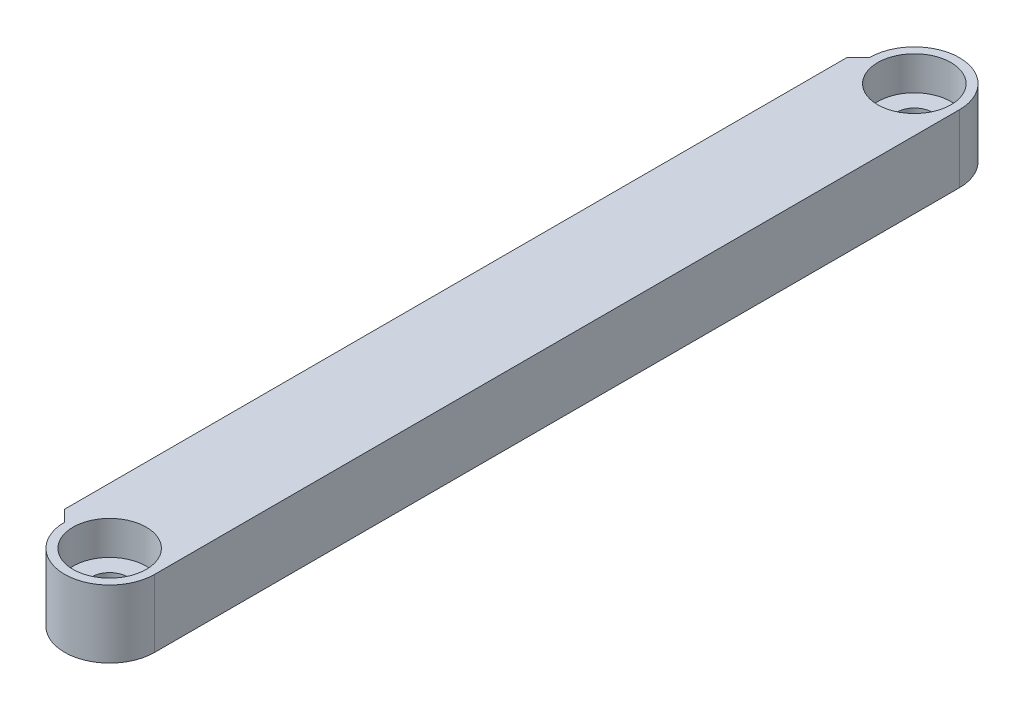
ISO-10303-21;
HEADER;
FILE_DESCRIPTION(('STEP AP214'),'2;1');
FILE_NAME('part.step','',(''),(''),'','','');
FILE_SCHEMA(('AUTOMOTIVE_DESIGN { 1 0 10303 214 1 1 1 1 }'));
ENDSEC;
DATA;
#1=APPLICATION_CONTEXT('core data for automotive mechanical design processes');
#2=APPLICATION_PROTOCOL_DEFINITION('international standard','automotive_design',2000,#1);
#3=PRODUCT_CONTEXT('',#1,'mechanical');
#4=PRODUCT('Part','Part','',(#3));
#5=PRODUCT_RELATED_PRODUCT_CATEGORY('part','',(#4));
#6=PRODUCT_DEFINITION_FORMATION('','',#4);
#7=PRODUCT_DEFINITION_CONTEXT('part definition',#1,'design');
#8=PRODUCT_DEFINITION('design','',#6,#7);
#9=PRODUCT_DEFINITION_SHAPE('','',#8);
#10=(LENGTH_UNIT() NAMED_UNIT(*) SI_UNIT(.MILLI.,.METRE.));
#11=(NAMED_UNIT(*) PLANE_ANGLE_UNIT() SI_UNIT($,.RADIAN.));
#12=(NAMED_UNIT(*) SI_UNIT($,.STERADIAN.) SOLID_ANGLE_UNIT());
#13=UNCERTAINTY_MEASURE_WITH_UNIT(LENGTH_MEASURE(1.E-05),#10,'distance_accuracy_value','');
#14=(GEOMETRIC_REPRESENTATION_CONTEXT(3) GLOBAL_UNCERTAINTY_ASSIGNED_CONTEXT((#13)) GLOBAL_UNIT_ASSIGNED_CONTEXT((#10,
#11,#12)) REPRESENTATION_CONTEXT('',''));
#15=CARTESIAN_POINT('',(0.,0.,0.));
#16=DIRECTION('',(0.,0.,1.));
#17=DIRECTION('',(1.,0.,0.));
#18=AXIS2_PLACEMENT_3D('',#15,#16,#17);
#19=CARTESIAN_POINT('',(0.,6.,0.));
#20=DIRECTION('',(0.,-1.,0.));
#21=DIRECTION('',(0.,0.,-1.));
#22=AXIS2_PLACEMENT_3D('',#19,#20,#21);
#23=CYLINDRICAL_SURFACE('',#22,1.6);
#24=CARTESIAN_POINT('',(0.,0.,0.));
#25=DIRECTION('',(0.,1.,0.));
#26=DIRECTION('',(0.,0.,1.));
#27=AXIS2_PLACEMENT_3D('',#24,#25,#26);
#28=CIRCLE('',#27,1.6);
#29=CARTESIAN_POINT('',(0.,0.,1.6));
#30=VERTEX_POINT('',#29);
#31=EDGE_CURVE('E153',#30,#30,#28,.T.);
#32=ORIENTED_EDGE('',*,*,#31,.F.);
#33=EDGE_LOOP('',(#32));
#34=FACE_BOUND('',#33,.T.);
#35=CARTESIAN_POINT('',(0.,3.,0.));
#36=DIRECTION('',(0.,1.,0.));
#37=DIRECTION('',(0.,0.,1.));
#38=AXIS2_PLACEMENT_3D('',#35,#36,#37);
#39=CIRCLE('',#38,1.6);
#40=CARTESIAN_POINT('',(0.,3.,1.6));
#41=VERTEX_POINT('',#40);
#42=EDGE_CURVE('E44',#41,#41,#39,.T.);
#43=ORIENTED_EDGE('',*,*,#42,.T.);
#44=EDGE_LOOP('',(#43));
#45=FACE_BOUND('',#44,.T.);
#46=ADVANCED_FACE('F39',(#34,#45),#23,.F.);
#47=CARTESIAN_POINT('',(0.,6.,71.4));
#48=DIRECTION('',(0.,-1.,0.));
#49=DIRECTION('',(0.,0.,-1.));
#50=AXIS2_PLACEMENT_3D('',#47,#48,#49);
#51=CYLINDRICAL_SURFACE('',#50,1.6);
#52=CARTESIAN_POINT('',(0.,0.,71.4));
#53=DIRECTION('',(0.,1.,0.));
#54=DIRECTION('',(0.,0.,1.));
#55=AXIS2_PLACEMENT_3D('',#52,#53,#54);
#56=CIRCLE('',#55,1.6);
#57=CARTESIAN_POINT('',(0.,0.,73.));
#58=VERTEX_POINT('',#57);
#59=EDGE_CURVE('E136',#58,#58,#56,.T.);
#60=ORIENTED_EDGE('',*,*,#59,.F.);
#61=EDGE_LOOP('',(#60));
#62=FACE_BOUND('',#61,.T.);
#63=CARTESIAN_POINT('',(0.,3.,71.4));
#64=DIRECTION('',(0.,1.,0.));
#65=DIRECTION('',(0.,0.,1.));
#66=AXIS2_PLACEMENT_3D('',#63,#64,#65);
#67=CIRCLE('',#66,1.6);
#68=CARTESIAN_POINT('',(0.,3.,73.));
#69=VERTEX_POINT('',#68);
#70=EDGE_CURVE('E130',#69,#69,#67,.T.);
#71=ORIENTED_EDGE('',*,*,#70,.T.);
#72=EDGE_LOOP('',(#71));
#73=FACE_BOUND('',#72,.T.);
#74=ADVANCED_FACE('F191',(#62,#73),#51,.F.);
#75=CARTESIAN_POINT('',(0.,6.,71.4));
#76=DIRECTION('',(0.,1.,0.));
#77=DIRECTION('',(0.,0.,1.));
#78=AXIS2_PLACEMENT_3D('',#75,#76,#77);
#79=PLANE('',#78);
#80=CARTESIAN_POINT('',(0.,6.,0.));
#81=DIRECTION('',(0.,1.,0.));
#82=DIRECTION('',(0.,0.,1.));
#83=AXIS2_PLACEMENT_3D('',#80,#81,#82);
#84=CIRCLE('',#83,3.25);
#85=CARTESIAN_POINT('',(0.,6.,3.25));
#86=VERTEX_POINT('',#85);
#87=EDGE_CURVE('E138',#86,#86,#84,.T.);
#88=ORIENTED_EDGE('',*,*,#87,.F.);
#89=EDGE_LOOP('',(#88));
#90=FACE_BOUND('',#89,.T.);
#91=CARTESIAN_POINT('',(0.,6.,71.4));
#92=DIRECTION('',(0.,1.,0.));
#93=DIRECTION('',(0.,0.,1.));
#94=AXIS2_PLACEMENT_3D('',#91,#92,#93);
#95=CIRCLE('',#94,3.25);
#96=CARTESIAN_POINT('',(0.,6.,74.65));
#97=VERTEX_POINT('',#96);
#98=EDGE_CURVE('E143',#97,#97,#95,.T.);
#99=ORIENTED_EDGE('',*,*,#98,.F.);
#100=EDGE_LOOP('',(#99));
#101=FACE_BOUND('',#100,.T.);
#102=CARTESIAN_POINT('',(0.,6.,0.));
#103=DIRECTION('',(0.,1.,0.));
#104=DIRECTION('',(0.,0.,1.));
#105=AXIS2_PLACEMENT_3D('',#102,#103,#104);
#106=CIRCLE('',#105,4.);
#107=CARTESIAN_POINT('',(4.,6.,0.));
#108=VERTEX_POINT('',#107);
#109=CARTESIAN_POINT('',(-4.,6.,0.));
#110=VERTEX_POINT('',#109);
#111=EDGE_CURVE('E103',#108,#110,#106,.T.);
#112=ORIENTED_EDGE('',*,*,#111,.T.);
#113=DIRECTION('',(0.707106781186548,0.,-0.707106781186548));
#114=VECTOR('',#113,1.);
#115=CARTESIAN_POINT('',(-37.7,6.,33.7));
#116=LINE('',#115,#114);
#117=CARTESIAN_POINT('',(-5.,6.,1.00000000000001));
#118=VERTEX_POINT('',#117);
#119=EDGE_CURVE('E11',#110,#118,#116,.F.);
#120=ORIENTED_EDGE('',*,*,#119,.T.);
#121=DIRECTION('',(0.,0.,1.));
#122=VECTOR('',#121,1.);
#123=CARTESIAN_POINT('',(-5.,6.,0.));
#124=LINE('',#123,#122);
#125=CARTESIAN_POINT('',(-4.99999999999999,6.,70.4));
#126=VERTEX_POINT('',#125);
#127=EDGE_CURVE('E157',#118,#126,#124,.T.);
#128=ORIENTED_EDGE('',*,*,#127,.T.);
#129=DIRECTION('',(-0.707106781186545,0.,-0.70710678118655));
#130=VECTOR('',#129,1.);
#131=CARTESIAN_POINT('',(-2.00000000000001,6.,73.4));
#132=LINE('',#131,#130);
#133=CARTESIAN_POINT('',(-4.,6.,71.4));
#134=VERTEX_POINT('',#133);
#135=EDGE_CURVE('E49',#126,#134,#132,.F.);
#136=ORIENTED_EDGE('',*,*,#135,.T.);
#137=CARTESIAN_POINT('',(0.,6.,71.4));
#138=DIRECTION('',(0.,1.,0.));
#139=DIRECTION('',(0.,0.,1.));
#140=AXIS2_PLACEMENT_3D('',#137,#138,#139);
#141=CIRCLE('',#140,4.);
#142=CARTESIAN_POINT('',(4.,6.,71.4));
#143=VERTEX_POINT('',#142);
#144=EDGE_CURVE('E104',#134,#143,#141,.T.);
#145=ORIENTED_EDGE('',*,*,#144,.T.);
#146=DIRECTION('',(0.,0.,-1.));
#147=VECTOR('',#146,1.);
#148=CARTESIAN_POINT('',(4.,6.,0.));
#149=LINE('',#148,#147);
#150=EDGE_CURVE('E94',#143,#108,#149,.T.);
#151=ORIENTED_EDGE('',*,*,#150,.T.);
#152=EDGE_LOOP('',(#112,#120,#128,#136,#145,#151));
#153=FACE_BOUND('',#152,.T.);
#154=ADVANCED_FACE('F107',(#90,#101,#153),#79,.T.);
#155=CARTESIAN_POINT('',(0.,0.,71.4));
#156=DIRECTION('',(0.,1.,0.));
#157=DIRECTION('',(0.,0.,1.));
#158=AXIS2_PLACEMENT_3D('',#155,#156,#157);
#159=PLANE('',#158);
#160=DIRECTION('',(0.,0.,1.));
#161=VECTOR('',#160,1.);
#162=CARTESIAN_POINT('',(-5.,0.,0.));
#163=LINE('',#162,#161);
#164=CARTESIAN_POINT('',(-5.,0.,1.00000000000001));
#165=VERTEX_POINT('',#164);
#166=CARTESIAN_POINT('',(-4.99999999999999,0.,70.4));
#167=VERTEX_POINT('',#166);
#168=EDGE_CURVE('E112',#165,#167,#163,.T.);
#169=ORIENTED_EDGE('',*,*,#168,.F.);
#170=DIRECTION('',(-0.707106781186548,0.,0.707106781186548));
#171=VECTOR('',#170,1.);
#172=CARTESIAN_POINT('',(-5.,0.,1.00000000000001));
#173=LINE('',#172,#171);
#174=CARTESIAN_POINT('',(-4.,0.,0.));
#175=VERTEX_POINT('',#174);
#176=EDGE_CURVE('E128',#165,#175,#173,.F.);
#177=ORIENTED_EDGE('',*,*,#176,.T.);
#178=CARTESIAN_POINT('',(0.,0.,0.));
#179=DIRECTION('',(0.,1.,0.));
#180=DIRECTION('',(0.,0.,1.));
#181=AXIS2_PLACEMENT_3D('',#178,#179,#180);
#182=CIRCLE('',#181,4.);
#183=CARTESIAN_POINT('',(4.,0.,0.));
#184=VERTEX_POINT('',#183);
#185=EDGE_CURVE('E163',#184,#175,#182,.T.);
#186=ORIENTED_EDGE('',*,*,#185,.F.);
#187=DIRECTION('',(0.,0.,-1.));
#188=VECTOR('',#187,1.);
#189=CARTESIAN_POINT('',(4.,0.,0.));
#190=LINE('',#189,#188);
#191=CARTESIAN_POINT('',(4.,0.,71.4));
#192=VERTEX_POINT('',#191);
#193=EDGE_CURVE('E161',#192,#184,#190,.T.);
#194=ORIENTED_EDGE('',*,*,#193,.F.);
#195=CARTESIAN_POINT('',(0.,0.,71.4));
#196=DIRECTION('',(0.,1.,0.));
#197=DIRECTION('',(0.,0.,1.));
#198=AXIS2_PLACEMENT_3D('',#195,#196,#197);
#199=CIRCLE('',#198,4.);
#200=CARTESIAN_POINT('',(-4.,0.,71.4));
#201=VERTEX_POINT('',#200);
#202=EDGE_CURVE('E116',#201,#192,#199,.T.);
#203=ORIENTED_EDGE('',*,*,#202,.F.);
#204=DIRECTION('',(0.707106781186545,0.,0.70710678118655));
#205=VECTOR('',#204,1.);
#206=CARTESIAN_POINT('',(-4.,0.,71.4));
#207=LINE('',#206,#205);
#208=EDGE_CURVE('E126',#201,#167,#207,.F.);
#209=ORIENTED_EDGE('',*,*,#208,.T.);
#210=EDGE_LOOP('',(#169,#177,#186,#194,#203,#209));
#211=FACE_BOUND('',#210,.T.);
#212=ORIENTED_EDGE('',*,*,#31,.T.);
#213=EDGE_LOOP('',(#212));
#214=FACE_BOUND('',#213,.T.);
#215=ORIENTED_EDGE('',*,*,#59,.T.);
#216=EDGE_LOOP('',(#215));
#217=FACE_BOUND('',#216,.T.);
#218=ADVANCED_FACE('F177',(#211,#214,#217),#159,.F.);
#219=CARTESIAN_POINT('',(0.,6.,71.4));
#220=DIRECTION('',(0.,-1.,0.));
#221=DIRECTION('',(0.,0.,-1.));
#222=AXIS2_PLACEMENT_3D('',#219,#220,#221);
#223=CYLINDRICAL_SURFACE('',#222,4.);
#224=ORIENTED_EDGE('',*,*,#202,.T.);
#225=DIRECTION('',(0.,-1.,0.));
#226=VECTOR('',#225,1.);
#227=CARTESIAN_POINT('',(4.,6.,71.4));
#228=LINE('',#227,#226);
#229=EDGE_CURVE('E98',#143,#192,#228,.T.);
#230=ORIENTED_EDGE('',*,*,#229,.F.);
#231=ORIENTED_EDGE('',*,*,#144,.F.);
#232=DIRECTION('',(0.,-1.,0.));
#233=VECTOR('',#232,1.);
#234=CARTESIAN_POINT('',(-4.,6.,71.4));
#235=LINE('',#234,#233);
#236=EDGE_CURVE('E159',#134,#201,#235,.T.);
#237=ORIENTED_EDGE('',*,*,#236,.T.);
#238=EDGE_LOOP('',(#224,#230,#231,#237));
#239=FACE_BOUND('',#238,.T.);
#240=ADVANCED_FACE('F114',(#239),#223,.T.);
#241=CARTESIAN_POINT('',(4.,6.,0.));
#242=DIRECTION('',(-1.,0.,0.));
#243=DIRECTION('',(0.,0.,1.));
#244=AXIS2_PLACEMENT_3D('',#241,#242,#243);
#245=PLANE('',#244);
#246=ORIENTED_EDGE('',*,*,#193,.T.);
#247=DIRECTION('',(0.,-1.,0.));
#248=VECTOR('',#247,1.);
#249=CARTESIAN_POINT('',(4.,6.,0.));
#250=LINE('',#249,#248);
#251=EDGE_CURVE('E101',#108,#184,#250,.T.);
#252=ORIENTED_EDGE('',*,*,#251,.F.);
#253=ORIENTED_EDGE('',*,*,#150,.F.);
#254=ORIENTED_EDGE('',*,*,#229,.T.);
#255=EDGE_LOOP('',(#246,#252,#253,#254));
#256=FACE_BOUND('',#255,.T.);
#257=ADVANCED_FACE('F96',(#256),#245,.F.);
#258=CARTESIAN_POINT('',(0.,6.,0.));
#259=DIRECTION('',(0.,-1.,0.));
#260=DIRECTION('',(0.,0.,-1.));
#261=AXIS2_PLACEMENT_3D('',#258,#259,#260);
#262=CYLINDRICAL_SURFACE('',#261,4.);
#263=ORIENTED_EDGE('',*,*,#185,.T.);
#264=DIRECTION('',(0.,-1.,0.));
#265=VECTOR('',#264,1.);
#266=CARTESIAN_POINT('',(-4.,6.,0.));
#267=LINE('',#266,#265);
#268=EDGE_CURVE('E120',#110,#175,#267,.T.);
#269=ORIENTED_EDGE('',*,*,#268,.F.);
#270=ORIENTED_EDGE('',*,*,#111,.F.);
#271=ORIENTED_EDGE('',*,*,#251,.T.);
#272=EDGE_LOOP('',(#263,#269,#270,#271));
#273=FACE_BOUND('',#272,.T.);
#274=ADVANCED_FACE('F173',(#273),#262,.T.);
#275=CARTESIAN_POINT('',(-5.,6.,0.));
#276=DIRECTION('',(1.,0.,0.));
#277=DIRECTION('',(0.,0.,-1.));
#278=AXIS2_PLACEMENT_3D('',#275,#276,#277);
#279=PLANE('',#278);
#280=ORIENTED_EDGE('',*,*,#127,.F.);
#281=DIRECTION('',(0.,-1.,0.));
#282=VECTOR('',#281,1.);
#283=CARTESIAN_POINT('',(-5.,6.,1.00000000000001));
#284=LINE('',#283,#282);
#285=EDGE_CURVE('E118',#118,#165,#284,.T.);
#286=ORIENTED_EDGE('',*,*,#285,.T.);
#287=ORIENTED_EDGE('',*,*,#168,.T.);
#288=DIRECTION('',(0.,1.,0.));
#289=VECTOR('',#288,1.);
#290=CARTESIAN_POINT('',(-4.99999999999999,6.,70.4));
#291=LINE('',#290,#289);
#292=EDGE_CURVE('E57',#167,#126,#291,.T.);
#293=ORIENTED_EDGE('',*,*,#292,.T.);
#294=EDGE_LOOP('',(#280,#286,#287,#293));
#295=FACE_BOUND('',#294,.T.);
#296=ADVANCED_FACE('F179',(#295),#279,.F.);
#297=CARTESIAN_POINT('',(-5.,6.,1.00000000000001));
#298=DIRECTION('',(0.707106781186547,0.,0.707106781186547));
#299=DIRECTION('',(0.,-1.,0.));
#300=AXIS2_PLACEMENT_3D('',#297,#298,#299);
#301=PLANE('',#300);
#302=ORIENTED_EDGE('',*,*,#119,.F.);
#303=ORIENTED_EDGE('',*,*,#268,.T.);
#304=ORIENTED_EDGE('',*,*,#176,.F.);
#305=ORIENTED_EDGE('',*,*,#285,.F.);
#306=EDGE_LOOP('',(#302,#303,#304,#305));
#307=FACE_BOUND('',#306,.T.);
#308=ADVANCED_FACE('F170',(#307),#301,.F.);
#309=CARTESIAN_POINT('',(-4.,6.,71.4));
#310=DIRECTION('',(0.70710678118655,0.,-0.707106781186545));
#311=DIRECTION('',(0.,-1.,0.));
#312=AXIS2_PLACEMENT_3D('',#309,#310,#311);
#313=PLANE('',#312);
#314=ORIENTED_EDGE('',*,*,#135,.F.);
#315=ORIENTED_EDGE('',*,*,#292,.F.);
#316=ORIENTED_EDGE('',*,*,#208,.F.);
#317=ORIENTED_EDGE('',*,*,#236,.F.);
#318=EDGE_LOOP('',(#314,#315,#316,#317));
#319=FACE_BOUND('',#318,.T.);
#320=ADVANCED_FACE('F42',(#319),#313,.F.);
#321=CARTESIAN_POINT('',(0.,3.,71.4));
#322=DIRECTION('',(0.,1.,0.));
#323=DIRECTION('',(0.,0.,1.));
#324=AXIS2_PLACEMENT_3D('',#321,#322,#323);
#325=CYLINDRICAL_SURFACE('',#324,3.25);
#326=CARTESIAN_POINT('',(0.,3.,71.4));
#327=DIRECTION('',(0.,1.,0.));
#328=DIRECTION('',(0.,0.,1.));
#329=AXIS2_PLACEMENT_3D('',#326,#327,#328);
#330=CIRCLE('',#329,3.25);
#331=CARTESIAN_POINT('',(0.,3.,74.65));
#332=VERTEX_POINT('',#331);
#333=EDGE_CURVE('E148',#332,#332,#330,.T.);
#334=ORIENTED_EDGE('',*,*,#333,.F.);
#335=EDGE_LOOP('',(#334));
#336=FACE_BOUND('',#335,.T.);
#337=ORIENTED_EDGE('',*,*,#98,.T.);
#338=EDGE_LOOP('',(#337));
#339=FACE_BOUND('',#338,.T.);
#340=ADVANCED_FACE('F182',(#336,#339),#325,.F.);
#341=CARTESIAN_POINT('',(0.,3.,71.4));
#342=DIRECTION('',(0.,1.,0.));
#343=DIRECTION('',(0.,0.,1.));
#344=AXIS2_PLACEMENT_3D('',#341,#342,#343);
#345=PLANE('',#344);
#346=ORIENTED_EDGE('',*,*,#70,.F.);
#347=EDGE_LOOP('',(#346));
#348=FACE_BOUND('',#347,.T.);
#349=ORIENTED_EDGE('',*,*,#333,.T.);
#350=EDGE_LOOP('',(#349));
#351=FACE_BOUND('',#350,.T.);
#352=ADVANCED_FACE('F187',(#348,#351),#345,.T.);
#353=CARTESIAN_POINT('',(0.,3.,0.));
#354=DIRECTION('',(0.,1.,0.));
#355=DIRECTION('',(0.,0.,1.));
#356=AXIS2_PLACEMENT_3D('',#353,#354,#355);
#357=CYLINDRICAL_SURFACE('',#356,3.25);
#358=CARTESIAN_POINT('',(0.,3.,0.));
#359=DIRECTION('',(0.,1.,0.));
#360=DIRECTION('',(0.,0.,1.));
#361=AXIS2_PLACEMENT_3D('',#358,#359,#360);
#362=CIRCLE('',#361,3.25);
#363=CARTESIAN_POINT('',(0.,3.,3.25));
#364=VERTEX_POINT('',#363);
#365=EDGE_CURVE('E132',#364,#364,#362,.T.);
#366=ORIENTED_EDGE('',*,*,#365,.F.);
#367=EDGE_LOOP('',(#366));
#368=FACE_BOUND('',#367,.T.);
#369=ORIENTED_EDGE('',*,*,#87,.T.);
#370=EDGE_LOOP('',(#369));
#371=FACE_BOUND('',#370,.T.);
#372=ADVANCED_FACE('F280',(#368,#371),#357,.F.);
#373=CARTESIAN_POINT('',(0.,3.,0.));
#374=DIRECTION('',(0.,1.,0.));
#375=DIRECTION('',(0.,0.,1.));
#376=AXIS2_PLACEMENT_3D('',#373,#374,#375);
#377=PLANE('',#376);
#378=ORIENTED_EDGE('',*,*,#42,.F.);
#379=EDGE_LOOP('',(#378));
#380=FACE_BOUND('',#379,.T.);
#381=ORIENTED_EDGE('',*,*,#365,.T.);
#382=EDGE_LOOP('',(#381));
#383=FACE_BOUND('',#382,.T.);
#384=ADVANCED_FACE('F290',(#380,#383),#377,.T.);
#385=CLOSED_SHELL('',(#46,#74,#154,#218,#240,#257,#274,#296,#308,#320,#340,#352,#372,#384));
#386=MANIFOLD_SOLID_BREP('B2',#385);
#387=ADVANCED_BREP_SHAPE_REPRESENTATION('',(#18,#386),#14);
#388=SHAPE_DEFINITION_REPRESENTATION(#9,#387);
ENDSEC;
END-ISO-10303-21;
